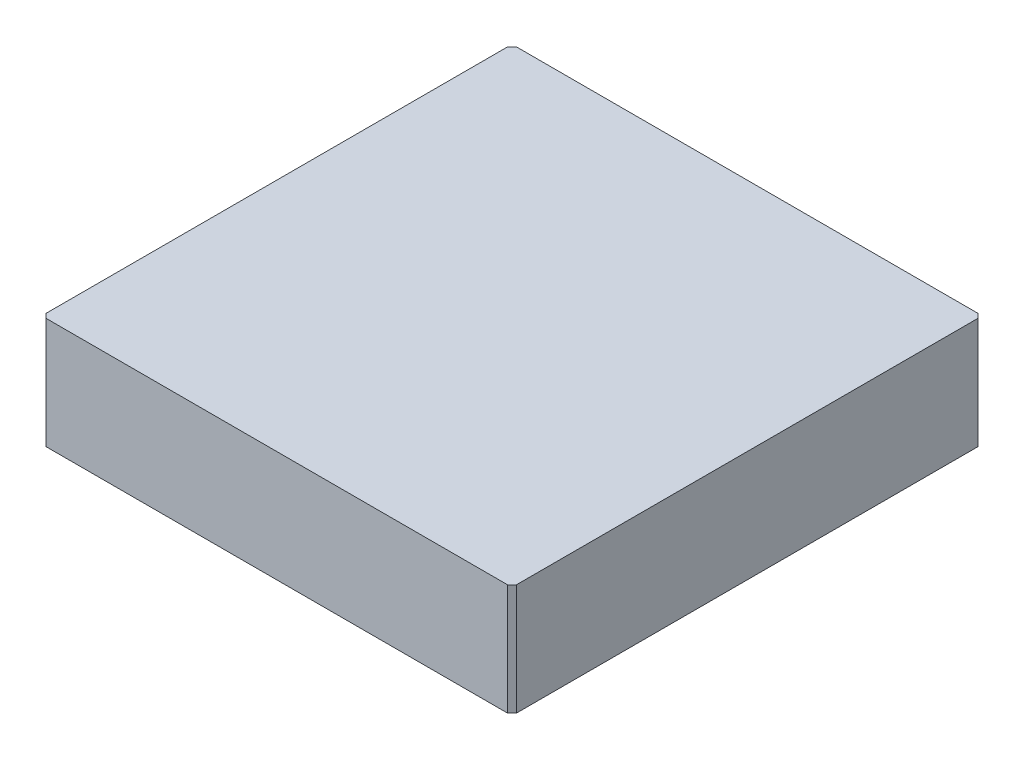
ISO-10303-21;
HEADER;
FILE_DESCRIPTION(('STEP AP214'),'2;1');
FILE_NAME('part.step','',(''),(''),'','','');
FILE_SCHEMA(('AUTOMOTIVE_DESIGN { 1 0 10303 214 1 1 1 1 }'));
ENDSEC;
DATA;
#1=APPLICATION_CONTEXT('core data for automotive mechanical design processes');
#2=APPLICATION_PROTOCOL_DEFINITION('international standard','automotive_design',2000,#1);
#3=PRODUCT_CONTEXT('',#1,'mechanical');
#4=PRODUCT('Part','Part','',(#3));
#5=PRODUCT_RELATED_PRODUCT_CATEGORY('part','',(#4));
#6=PRODUCT_DEFINITION_FORMATION('','',#4);
#7=PRODUCT_DEFINITION_CONTEXT('part definition',#1,'design');
#8=PRODUCT_DEFINITION('design','',#6,#7);
#9=PRODUCT_DEFINITION_SHAPE('','',#8);
#10=(LENGTH_UNIT() NAMED_UNIT(*) SI_UNIT(.MILLI.,.METRE.));
#11=(NAMED_UNIT(*) PLANE_ANGLE_UNIT() SI_UNIT($,.RADIAN.));
#12=(NAMED_UNIT(*) SI_UNIT($,.STERADIAN.) SOLID_ANGLE_UNIT());
#13=UNCERTAINTY_MEASURE_WITH_UNIT(LENGTH_MEASURE(1.E-05),#10,'distance_accuracy_value','');
#14=(GEOMETRIC_REPRESENTATION_CONTEXT(3) GLOBAL_UNCERTAINTY_ASSIGNED_CONTEXT((#13)) GLOBAL_UNIT_ASSIGNED_CONTEXT((#10,
#11,#12)) REPRESENTATION_CONTEXT('',''));
#15=CARTESIAN_POINT('',(0.,0.,0.));
#16=DIRECTION('',(0.,0.,1.));
#17=DIRECTION('',(1.,0.,0.));
#18=AXIS2_PLACEMENT_3D('',#15,#16,#17);
#19=CARTESIAN_POINT('',(55.,26.,-55.));
#20=DIRECTION('',(-1.,0.,0.));
#21=DIRECTION('',(0.,0.,1.));
#22=AXIS2_PLACEMENT_3D('',#19,#20,#21);
#23=PLANE('',#22);
#24=DIRECTION('',(0.,0.,-1.));
#25=VECTOR('',#24,1.);
#26=CARTESIAN_POINT('',(55.,0.,-55.));
#27=LINE('',#26,#25);
#28=CARTESIAN_POINT('',(55.,0.,54.));
#29=VERTEX_POINT('',#28);
#30=CARTESIAN_POINT('',(55.,0.,-54.));
#31=VERTEX_POINT('',#30);
#32=EDGE_CURVE('E129',#29,#31,#27,.T.);
#33=ORIENTED_EDGE('',*,*,#32,.T.);
#34=DIRECTION('',(0.,1.,0.));
#35=VECTOR('',#34,1.);
#36=CARTESIAN_POINT('',(55.,26.,-54.));
#37=LINE('',#36,#35);
#38=CARTESIAN_POINT('',(55.,26.,-54.));
#39=VERTEX_POINT('',#38);
#40=EDGE_CURVE('E152',#31,#39,#37,.T.);
#41=ORIENTED_EDGE('',*,*,#40,.T.);
#42=DIRECTION('',(0.,0.,-1.));
#43=VECTOR('',#42,1.);
#44=CARTESIAN_POINT('',(55.,26.,-55.));
#45=LINE('',#44,#43);
#46=CARTESIAN_POINT('',(55.,26.,54.));
#47=VERTEX_POINT('',#46);
#48=EDGE_CURVE('E127',#47,#39,#45,.T.);
#49=ORIENTED_EDGE('',*,*,#48,.F.);
#50=DIRECTION('',(0.,-1.,0.));
#51=VECTOR('',#50,1.);
#52=CARTESIAN_POINT('',(55.,26.,54.));
#53=LINE('',#52,#51);
#54=EDGE_CURVE('E149',#47,#29,#53,.T.);
#55=ORIENTED_EDGE('',*,*,#54,.T.);
#56=EDGE_LOOP('',(#33,#41,#49,#55));
#57=FACE_BOUND('',#56,.T.);
#58=ADVANCED_FACE('F34',(#57),#23,.F.);
#59=CARTESIAN_POINT('',(-55.,26.,-55.));
#60=DIRECTION('',(0.,0.,1.));
#61=DIRECTION('',(1.,0.,0.));
#62=AXIS2_PLACEMENT_3D('',#59,#60,#61);
#63=PLANE('',#62);
#64=DIRECTION('',(-1.,0.,0.));
#65=VECTOR('',#64,1.);
#66=CARTESIAN_POINT('',(-55.,0.,-55.));
#67=LINE('',#66,#65);
#68=CARTESIAN_POINT('',(54.,0.,-55.));
#69=VERTEX_POINT('',#68);
#70=CARTESIAN_POINT('',(-54.,0.,-55.));
#71=VERTEX_POINT('',#70);
#72=EDGE_CURVE('E125',#69,#71,#67,.T.);
#73=ORIENTED_EDGE('',*,*,#72,.T.);
#74=DIRECTION('',(0.,1.,0.));
#75=VECTOR('',#74,1.);
#76=CARTESIAN_POINT('',(-54.,26.,-55.));
#77=LINE('',#76,#75);
#78=CARTESIAN_POINT('',(-54.,26.,-55.));
#79=VERTEX_POINT('',#78);
#80=EDGE_CURVE('E104',#71,#79,#77,.T.);
#81=ORIENTED_EDGE('',*,*,#80,.T.);
#82=DIRECTION('',(-1.,0.,0.));
#83=VECTOR('',#82,1.);
#84=CARTESIAN_POINT('',(-55.,26.,-55.));
#85=LINE('',#84,#83);
#86=CARTESIAN_POINT('',(54.,26.,-55.));
#87=VERTEX_POINT('',#86);
#88=EDGE_CURVE('E168',#87,#79,#85,.T.);
#89=ORIENTED_EDGE('',*,*,#88,.F.);
#90=DIRECTION('',(0.,-1.,0.));
#91=VECTOR('',#90,1.);
#92=CARTESIAN_POINT('',(54.,26.,-55.));
#93=LINE('',#92,#91);
#94=EDGE_CURVE('E109',#87,#69,#93,.T.);
#95=ORIENTED_EDGE('',*,*,#94,.T.);
#96=EDGE_LOOP('',(#73,#81,#89,#95));
#97=FACE_BOUND('',#96,.T.);
#98=ADVANCED_FACE('F185',(#97),#63,.F.);
#99=CARTESIAN_POINT('',(-55.,26.,-55.));
#100=DIRECTION('',(1.,0.,0.));
#101=DIRECTION('',(0.,0.,-1.));
#102=AXIS2_PLACEMENT_3D('',#99,#100,#101);
#103=PLANE('',#102);
#104=DIRECTION('',(0.,0.,1.));
#105=VECTOR('',#104,1.);
#106=CARTESIAN_POINT('',(-55.,26.,-55.));
#107=LINE('',#106,#105);
#108=CARTESIAN_POINT('',(-55.,26.,-54.));
#109=VERTEX_POINT('',#108);
#110=CARTESIAN_POINT('',(-55.,26.,54.));
#111=VERTEX_POINT('',#110);
#112=EDGE_CURVE('E118',#109,#111,#107,.T.);
#113=ORIENTED_EDGE('',*,*,#112,.F.);
#114=DIRECTION('',(0.,-1.,0.));
#115=VECTOR('',#114,1.);
#116=CARTESIAN_POINT('',(-55.,26.,-54.));
#117=LINE('',#116,#115);
#118=CARTESIAN_POINT('',(-55.,0.,-54.));
#119=VERTEX_POINT('',#118);
#120=EDGE_CURVE('E103',#109,#119,#117,.T.);
#121=ORIENTED_EDGE('',*,*,#120,.T.);
#122=DIRECTION('',(0.,0.,1.));
#123=VECTOR('',#122,1.);
#124=CARTESIAN_POINT('',(-55.,0.,-55.));
#125=LINE('',#124,#123);
#126=CARTESIAN_POINT('',(-55.,0.,54.));
#127=VERTEX_POINT('',#126);
#128=EDGE_CURVE('E116',#119,#127,#125,.T.);
#129=ORIENTED_EDGE('',*,*,#128,.T.);
#130=DIRECTION('',(0.,1.,0.));
#131=VECTOR('',#130,1.);
#132=CARTESIAN_POINT('',(-55.,26.,54.));
#133=LINE('',#132,#131);
#134=EDGE_CURVE('E120',#127,#111,#133,.T.);
#135=ORIENTED_EDGE('',*,*,#134,.T.);
#136=EDGE_LOOP('',(#113,#121,#129,#135));
#137=FACE_BOUND('',#136,.T.);
#138=ADVANCED_FACE('F115',(#137),#103,.F.);
#139=CARTESIAN_POINT('',(-55.,26.,55.));
#140=DIRECTION('',(0.,0.,-1.));
#141=DIRECTION('',(-1.,0.,0.));
#142=AXIS2_PLACEMENT_3D('',#139,#140,#141);
#143=PLANE('',#142);
#144=DIRECTION('',(1.,0.,0.));
#145=VECTOR('',#144,1.);
#146=CARTESIAN_POINT('',(-55.,0.,55.));
#147=LINE('',#146,#145);
#148=CARTESIAN_POINT('',(-54.,0.,55.));
#149=VERTEX_POINT('',#148);
#150=CARTESIAN_POINT('',(54.,0.,55.));
#151=VERTEX_POINT('',#150);
#152=EDGE_CURVE('E124',#149,#151,#147,.T.);
#153=ORIENTED_EDGE('',*,*,#152,.T.);
#154=DIRECTION('',(0.,1.,0.));
#155=VECTOR('',#154,1.);
#156=CARTESIAN_POINT('',(54.,26.,55.));
#157=LINE('',#156,#155);
#158=CARTESIAN_POINT('',(53.9999999999999,26.,55.));
#159=VERTEX_POINT('',#158);
#160=EDGE_CURVE('E11',#151,#159,#157,.T.);
#161=ORIENTED_EDGE('',*,*,#160,.T.);
#162=DIRECTION('',(1.,0.,0.));
#163=VECTOR('',#162,1.);
#164=CARTESIAN_POINT('',(-55.,26.,55.));
#165=LINE('',#164,#163);
#166=CARTESIAN_POINT('',(-54.,26.,55.));
#167=VERTEX_POINT('',#166);
#168=EDGE_CURVE('E133',#167,#159,#165,.T.);
#169=ORIENTED_EDGE('',*,*,#168,.F.);
#170=DIRECTION('',(0.,-1.,0.));
#171=VECTOR('',#170,1.);
#172=CARTESIAN_POINT('',(-54.,26.,55.));
#173=LINE('',#172,#171);
#174=EDGE_CURVE('E42',#167,#149,#173,.T.);
#175=ORIENTED_EDGE('',*,*,#174,.T.);
#176=EDGE_LOOP('',(#153,#161,#169,#175));
#177=FACE_BOUND('',#176,.T.);
#178=ADVANCED_FACE('F155',(#177),#143,.F.);
#179=CARTESIAN_POINT('',(0.,26.,0.));
#180=DIRECTION('',(0.,1.,0.));
#181=DIRECTION('',(0.,0.,1.));
#182=AXIS2_PLACEMENT_3D('',#179,#180,#181);
#183=PLANE('',#182);
#184=ORIENTED_EDGE('',*,*,#88,.T.);
#185=DIRECTION('',(0.707106781186552,0.,-0.707106781186543));
#186=VECTOR('',#185,1.);
#187=CARTESIAN_POINT('',(-54.4999999999996,26.,-54.5000000000004));
#188=LINE('',#187,#186);
#189=EDGE_CURVE('E147',#79,#109,#188,.F.);
#190=ORIENTED_EDGE('',*,*,#189,.T.);
#191=ORIENTED_EDGE('',*,*,#112,.T.);
#192=DIRECTION('',(-0.707106781186548,0.,-0.707106781186548));
#193=VECTOR('',#192,1.);
#194=CARTESIAN_POINT('',(-54.5,26.,54.5));
#195=LINE('',#194,#193);
#196=EDGE_CURVE('E54',#111,#167,#195,.F.);
#197=ORIENTED_EDGE('',*,*,#196,.T.);
#198=ORIENTED_EDGE('',*,*,#168,.T.);
#199=DIRECTION('',(-0.707106781186552,0.,0.707106781186543));
#200=VECTOR('',#199,1.);
#201=CARTESIAN_POINT('',(54.4999999999996,26.,54.5000000000004));
#202=LINE('',#201,#200);
#203=EDGE_CURVE('E143',#159,#47,#202,.F.);
#204=ORIENTED_EDGE('',*,*,#203,.T.);
#205=ORIENTED_EDGE('',*,*,#48,.T.);
#206=DIRECTION('',(0.707106781186548,0.,0.707106781186548));
#207=VECTOR('',#206,1.);
#208=CARTESIAN_POINT('',(54.5,26.,-54.5));
#209=LINE('',#208,#207);
#210=EDGE_CURVE('E145',#39,#87,#209,.F.);
#211=ORIENTED_EDGE('',*,*,#210,.T.);
#212=EDGE_LOOP('',(#184,#190,#191,#197,#198,#204,#205,#211));
#213=FACE_BOUND('',#212,.T.);
#214=ADVANCED_FACE('F174',(#213),#183,.T.);
#215=CARTESIAN_POINT('',(0.,0.,0.));
#216=DIRECTION('',(0.,1.,0.));
#217=DIRECTION('',(0.,0.,1.));
#218=AXIS2_PLACEMENT_3D('',#215,#216,#217);
#219=PLANE('',#218);
#220=ORIENTED_EDGE('',*,*,#128,.F.);
#221=DIRECTION('',(-0.707106781186552,0.,0.707106781186543));
#222=VECTOR('',#221,1.);
#223=CARTESIAN_POINT('',(-55.,0.,-54.));
#224=LINE('',#223,#222);
#225=EDGE_CURVE('E99',#119,#71,#224,.F.);
#226=ORIENTED_EDGE('',*,*,#225,.T.);
#227=ORIENTED_EDGE('',*,*,#72,.F.);
#228=DIRECTION('',(-0.707106781186548,0.,-0.707106781186548));
#229=VECTOR('',#228,1.);
#230=CARTESIAN_POINT('',(54.,0.,-55.));
#231=LINE('',#230,#229);
#232=EDGE_CURVE('E110',#69,#31,#231,.F.);
#233=ORIENTED_EDGE('',*,*,#232,.T.);
#234=ORIENTED_EDGE('',*,*,#32,.F.);
#235=DIRECTION('',(0.707106781186552,0.,-0.707106781186543));
#236=VECTOR('',#235,1.);
#237=CARTESIAN_POINT('',(55.,0.,54.));
#238=LINE('',#237,#236);
#239=EDGE_CURVE('E136',#29,#151,#238,.F.);
#240=ORIENTED_EDGE('',*,*,#239,.T.);
#241=ORIENTED_EDGE('',*,*,#152,.F.);
#242=DIRECTION('',(0.707106781186548,0.,0.707106781186548));
#243=VECTOR('',#242,1.);
#244=CARTESIAN_POINT('',(-54.,0.,55.));
#245=LINE('',#244,#243);
#246=EDGE_CURVE('E119',#149,#127,#245,.F.);
#247=ORIENTED_EDGE('',*,*,#246,.T.);
#248=EDGE_LOOP('',(#220,#226,#227,#233,#234,#240,#241,#247));
#249=FACE_BOUND('',#248,.T.);
#250=ADVANCED_FACE('F122',(#249),#219,.F.);
#251=CARTESIAN_POINT('',(-55.,26.,-54.));
#252=DIRECTION('',(0.707106781186543,0.,0.707106781186552));
#253=DIRECTION('',(0.,-1.,0.));
#254=AXIS2_PLACEMENT_3D('',#251,#252,#253);
#255=PLANE('',#254);
#256=ORIENTED_EDGE('',*,*,#189,.F.);
#257=ORIENTED_EDGE('',*,*,#80,.F.);
#258=ORIENTED_EDGE('',*,*,#225,.F.);
#259=ORIENTED_EDGE('',*,*,#120,.F.);
#260=EDGE_LOOP('',(#256,#257,#258,#259));
#261=FACE_BOUND('',#260,.T.);
#262=ADVANCED_FACE('F102',(#261),#255,.F.);
#263=CARTESIAN_POINT('',(54.,26.,-55.));
#264=DIRECTION('',(-0.707106781186547,0.,0.707106781186547));
#265=DIRECTION('',(0.,-1.,0.));
#266=AXIS2_PLACEMENT_3D('',#263,#264,#265);
#267=PLANE('',#266);
#268=ORIENTED_EDGE('',*,*,#210,.F.);
#269=ORIENTED_EDGE('',*,*,#40,.F.);
#270=ORIENTED_EDGE('',*,*,#232,.F.);
#271=ORIENTED_EDGE('',*,*,#94,.F.);
#272=EDGE_LOOP('',(#268,#269,#270,#271));
#273=FACE_BOUND('',#272,.T.);
#274=ADVANCED_FACE('F196',(#273),#267,.F.);
#275=CARTESIAN_POINT('',(55.,26.,54.));
#276=DIRECTION('',(-0.707106781186543,0.,-0.707106781186552));
#277=DIRECTION('',(0.,-1.,0.));
#278=AXIS2_PLACEMENT_3D('',#275,#276,#277);
#279=PLANE('',#278);
#280=ORIENTED_EDGE('',*,*,#203,.F.);
#281=ORIENTED_EDGE('',*,*,#160,.F.);
#282=ORIENTED_EDGE('',*,*,#239,.F.);
#283=ORIENTED_EDGE('',*,*,#54,.F.);
#284=EDGE_LOOP('',(#280,#281,#282,#283));
#285=FACE_BOUND('',#284,.T.);
#286=ADVANCED_FACE('F162',(#285),#279,.F.);
#287=CARTESIAN_POINT('',(-54.,26.,55.));
#288=DIRECTION('',(0.707106781186547,0.,-0.707106781186547));
#289=DIRECTION('',(0.,-1.,0.));
#290=AXIS2_PLACEMENT_3D('',#287,#288,#289);
#291=PLANE('',#290);
#292=ORIENTED_EDGE('',*,*,#196,.F.);
#293=ORIENTED_EDGE('',*,*,#134,.F.);
#294=ORIENTED_EDGE('',*,*,#246,.F.);
#295=ORIENTED_EDGE('',*,*,#174,.F.);
#296=EDGE_LOOP('',(#292,#293,#294,#295));
#297=FACE_BOUND('',#296,.T.);
#298=ADVANCED_FACE('F36',(#297),#291,.F.);
#299=CLOSED_SHELL('',(#58,#98,#138,#178,#214,#250,#262,#274,#286,#298));
#300=MANIFOLD_SOLID_BREP('B2',#299);
#301=ADVANCED_BREP_SHAPE_REPRESENTATION('',(#18,#300),#14);
#302=SHAPE_DEFINITION_REPRESENTATION(#9,#301);
ENDSEC;
END-ISO-10303-21;
